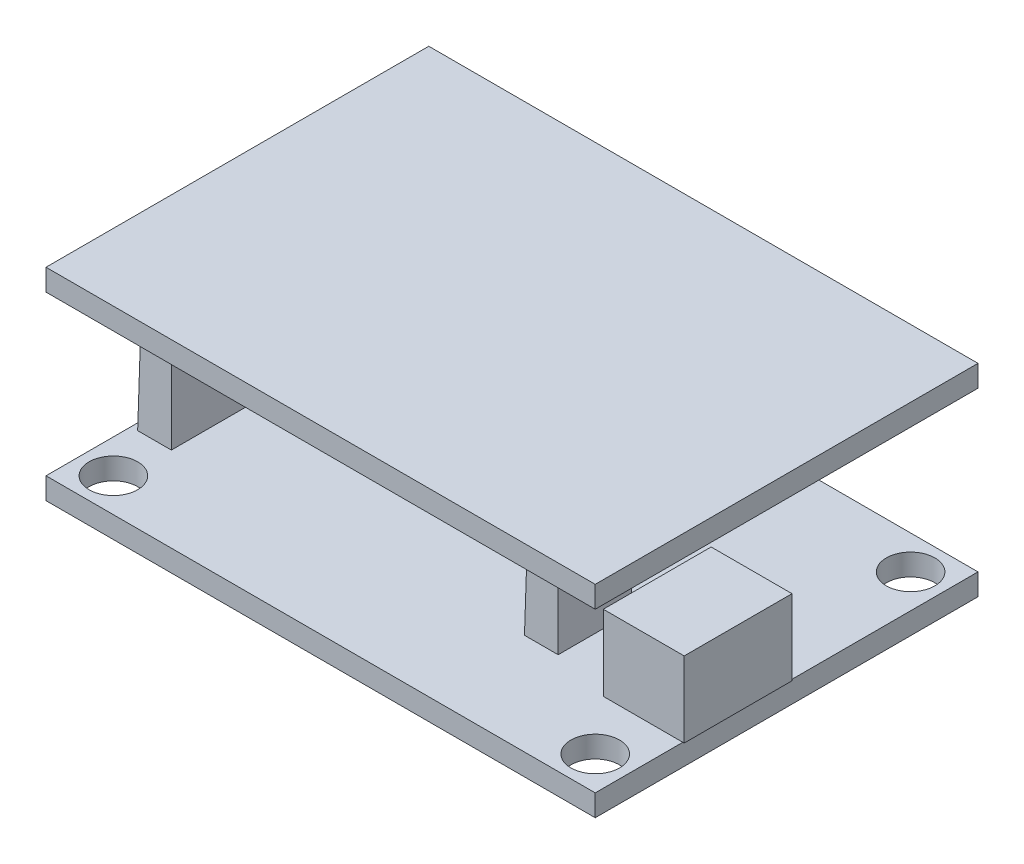
ISO-10303-21;
HEADER;
FILE_DESCRIPTION(('STEP AP214'),'2;1');
FILE_NAME('part.step','',(''),(''),'','','');
FILE_SCHEMA(('AUTOMOTIVE_DESIGN { 1 0 10303 214 1 1 1 1 }'));
ENDSEC;
DATA;
#1=APPLICATION_CONTEXT('core data for automotive mechanical design processes');
#2=APPLICATION_PROTOCOL_DEFINITION('international standard','automotive_design',2000,#1);
#3=PRODUCT_CONTEXT('',#1,'mechanical');
#4=PRODUCT('Part','Part','',(#3));
#5=PRODUCT_RELATED_PRODUCT_CATEGORY('part','',(#4));
#6=PRODUCT_DEFINITION_FORMATION('','',#4);
#7=PRODUCT_DEFINITION_CONTEXT('part definition',#1,'design');
#8=PRODUCT_DEFINITION('design','',#6,#7);
#9=PRODUCT_DEFINITION_SHAPE('','',#8);
#10=(LENGTH_UNIT() NAMED_UNIT(*) SI_UNIT(.MILLI.,.METRE.));
#11=(NAMED_UNIT(*) PLANE_ANGLE_UNIT() SI_UNIT($,.RADIAN.));
#12=(NAMED_UNIT(*) SI_UNIT($,.STERADIAN.) SOLID_ANGLE_UNIT());
#13=UNCERTAINTY_MEASURE_WITH_UNIT(LENGTH_MEASURE(1.E-05),#10,'distance_accuracy_value','');
#14=(GEOMETRIC_REPRESENTATION_CONTEXT(3) GLOBAL_UNCERTAINTY_ASSIGNED_CONTEXT((#13)) GLOBAL_UNIT_ASSIGNED_CONTEXT((#10,
#11,#12)) REPRESENTATION_CONTEXT('',''));
#15=CARTESIAN_POINT('',(0.,0.,0.));
#16=DIRECTION('',(0.,0.,1.));
#17=DIRECTION('',(1.,0.,0.));
#18=AXIS2_PLACEMENT_3D('',#15,#16,#17);
#19=CARTESIAN_POINT('',(40.75,13.4,0.));
#20=DIRECTION('',(-1.,0.,0.));
#21=DIRECTION('',(0.,0.,1.));
#22=AXIS2_PLACEMENT_3D('',#19,#20,#21);
#23=PLANE('',#22);
#24=DIRECTION('',(0.,0.,1.));
#25=VECTOR('',#24,1.);
#26=CARTESIAN_POINT('',(40.75,15.,0.));
#27=LINE('',#26,#25);
#28=CARTESIAN_POINT('',(40.75,15.,-28.4));
#29=VERTEX_POINT('',#28);
#30=CARTESIAN_POINT('',(40.75,15.,0.));
#31=VERTEX_POINT('',#30);
#32=EDGE_CURVE('E105',#29,#31,#27,.T.);
#33=ORIENTED_EDGE('',*,*,#32,.T.);
#34=DIRECTION('',(0.,1.,0.));
#35=VECTOR('',#34,1.);
#36=CARTESIAN_POINT('',(40.75,13.4,0.));
#37=LINE('',#36,#35);
#38=CARTESIAN_POINT('',(40.75,13.4,0.));
#39=VERTEX_POINT('',#38);
#40=EDGE_CURVE('E12',#39,#31,#37,.T.);
#41=ORIENTED_EDGE('',*,*,#40,.F.);
#42=DIRECTION('',(0.,0.,1.));
#43=VECTOR('',#42,1.);
#44=CARTESIAN_POINT('',(40.75,13.4,0.));
#45=LINE('',#44,#43);
#46=CARTESIAN_POINT('',(40.75,13.4,-28.4));
#47=VERTEX_POINT('',#46);
#48=EDGE_CURVE('E93',#47,#39,#45,.T.);
#49=ORIENTED_EDGE('',*,*,#48,.F.);
#50=DIRECTION('',(0.,1.,0.));
#51=VECTOR('',#50,1.);
#52=CARTESIAN_POINT('',(40.75,13.4,-28.4));
#53=LINE('',#52,#51);
#54=EDGE_CURVE('E101',#47,#29,#53,.T.);
#55=ORIENTED_EDGE('',*,*,#54,.T.);
#56=EDGE_LOOP('',(#33,#41,#49,#55));
#57=FACE_BOUND('',#56,.T.);
#58=ADVANCED_FACE('F42',(#57),#23,.F.);
#59=CARTESIAN_POINT('',(40.75,13.4,0.));
#60=DIRECTION('',(0.,0.,-1.));
#61=DIRECTION('',(-1.,0.,0.));
#62=AXIS2_PLACEMENT_3D('',#59,#60,#61);
#63=PLANE('',#62);
#64=DIRECTION('',(-1.,0.,0.));
#65=VECTOR('',#64,1.);
#66=CARTESIAN_POINT('',(40.75,15.,0.));
#67=LINE('',#66,#65);
#68=CARTESIAN_POINT('',(0.,15.,0.));
#69=VERTEX_POINT('',#68);
#70=EDGE_CURVE('E97',#31,#69,#67,.T.);
#71=ORIENTED_EDGE('',*,*,#70,.T.);
#72=DIRECTION('',(0.,1.,0.));
#73=VECTOR('',#72,1.);
#74=CARTESIAN_POINT('',(0.,13.4,0.));
#75=LINE('',#74,#73);
#76=CARTESIAN_POINT('',(0.,13.4,0.));
#77=VERTEX_POINT('',#76);
#78=EDGE_CURVE('E50',#77,#69,#75,.T.);
#79=ORIENTED_EDGE('',*,*,#78,.F.);
#80=DIRECTION('',(-1.,0.,0.));
#81=VECTOR('',#80,1.);
#82=CARTESIAN_POINT('',(40.75,13.4,0.));
#83=LINE('',#82,#81);
#84=EDGE_CURVE('E88',#39,#77,#83,.T.);
#85=ORIENTED_EDGE('',*,*,#84,.F.);
#86=ORIENTED_EDGE('',*,*,#40,.T.);
#87=EDGE_LOOP('',(#71,#79,#85,#86));
#88=FACE_BOUND('',#87,.T.);
#89=ADVANCED_FACE('F96',(#88),#63,.F.);
#90=CARTESIAN_POINT('',(0.,13.4,0.));
#91=DIRECTION('',(1.,0.,0.));
#92=DIRECTION('',(0.,0.,-1.));
#93=AXIS2_PLACEMENT_3D('',#90,#91,#92);
#94=PLANE('',#93);
#95=DIRECTION('',(0.,0.,-1.));
#96=VECTOR('',#95,1.);
#97=CARTESIAN_POINT('',(0.,15.,0.));
#98=LINE('',#97,#96);
#99=CARTESIAN_POINT('',(0.,15.,-28.4));
#100=VERTEX_POINT('',#99);
#101=EDGE_CURVE('E75',#69,#100,#98,.T.);
#102=ORIENTED_EDGE('',*,*,#101,.T.);
#103=DIRECTION('',(0.,1.,0.));
#104=VECTOR('',#103,1.);
#105=CARTESIAN_POINT('',(0.,13.4,-28.4));
#106=LINE('',#105,#104);
#107=CARTESIAN_POINT('',(0.,13.4,-28.4));
#108=VERTEX_POINT('',#107);
#109=EDGE_CURVE('E98',#108,#100,#106,.T.);
#110=ORIENTED_EDGE('',*,*,#109,.F.);
#111=DIRECTION('',(0.,0.,-1.));
#112=VECTOR('',#111,1.);
#113=CARTESIAN_POINT('',(0.,13.4,0.));
#114=LINE('',#113,#112);
#115=EDGE_CURVE('E91',#77,#108,#114,.T.);
#116=ORIENTED_EDGE('',*,*,#115,.F.);
#117=ORIENTED_EDGE('',*,*,#78,.T.);
#118=EDGE_LOOP('',(#102,#110,#116,#117));
#119=FACE_BOUND('',#118,.T.);
#120=ADVANCED_FACE('F99',(#119),#94,.F.);
#121=CARTESIAN_POINT('',(40.75,13.4,-28.4));
#122=DIRECTION('',(0.,0.,1.));
#123=DIRECTION('',(1.,0.,0.));
#124=AXIS2_PLACEMENT_3D('',#121,#122,#123);
#125=PLANE('',#124);
#126=DIRECTION('',(1.,0.,0.));
#127=VECTOR('',#126,1.);
#128=CARTESIAN_POINT('',(40.75,15.,-28.4));
#129=LINE('',#128,#127);
#130=EDGE_CURVE('E81',#100,#29,#129,.T.);
#131=ORIENTED_EDGE('',*,*,#130,.T.);
#132=ORIENTED_EDGE('',*,*,#54,.F.);
#133=DIRECTION('',(1.,0.,0.));
#134=VECTOR('',#133,1.);
#135=CARTESIAN_POINT('',(40.75,13.4,-28.4));
#136=LINE('',#135,#134);
#137=EDGE_CURVE('E58',#108,#47,#136,.T.);
#138=ORIENTED_EDGE('',*,*,#137,.F.);
#139=ORIENTED_EDGE('',*,*,#109,.T.);
#140=EDGE_LOOP('',(#131,#132,#138,#139));
#141=FACE_BOUND('',#140,.T.);
#142=ADVANCED_FACE('F112',(#141),#125,.F.);
#143=CARTESIAN_POINT('',(40.75,13.4,-28.4));
#144=DIRECTION('',(0.,1.,0.));
#145=DIRECTION('',(0.,0.,1.));
#146=AXIS2_PLACEMENT_3D('',#143,#144,#145);
#147=PLANE('',#146);
#148=ORIENTED_EDGE('',*,*,#48,.T.);
#149=ORIENTED_EDGE('',*,*,#84,.T.);
#150=ORIENTED_EDGE('',*,*,#115,.T.);
#151=ORIENTED_EDGE('',*,*,#137,.T.);
#152=EDGE_LOOP('',(#148,#149,#150,#151));
#153=FACE_BOUND('',#152,.T.);
#154=ADVANCED_FACE('F89',(#153),#147,.F.);
#155=CARTESIAN_POINT('',(40.75,15.,-28.4));
#156=DIRECTION('',(0.,1.,0.));
#157=DIRECTION('',(0.,0.,1.));
#158=AXIS2_PLACEMENT_3D('',#155,#156,#157);
#159=PLANE('',#158);
#160=ORIENTED_EDGE('',*,*,#32,.F.);
#161=ORIENTED_EDGE('',*,*,#130,.F.);
#162=ORIENTED_EDGE('',*,*,#101,.F.);
#163=ORIENTED_EDGE('',*,*,#70,.F.);
#164=EDGE_LOOP('',(#160,#161,#162,#163));
#165=FACE_BOUND('',#164,.T.);
#166=ADVANCED_FACE('F115',(#165),#159,.T.);
#167=CLOSED_SHELL('',(#58,#89,#120,#142,#154,#166));
#168=MANIFOLD_SOLID_BREP('B2',#167);
#169=CARTESIAN_POINT('',(0.,1.6,-28.4));
#170=DIRECTION('',(0.,-1.,0.));
#171=DIRECTION('',(0.,0.,-1.));
#172=AXIS2_PLACEMENT_3D('',#169,#170,#171);
#173=PLANE('',#172);
#174=DIRECTION('',(-1.,0.,0.));
#175=VECTOR('',#174,1.);
#176=CARTESIAN_POINT('',(28.,1.6,-7.5));
#177=LINE('',#176,#175);
#178=CARTESIAN_POINT('',(30.5,1.6,-7.5));
#179=VERTEX_POINT('',#178);
#180=CARTESIAN_POINT('',(28.,1.6,-7.5));
#181=VERTEX_POINT('',#180);
#182=EDGE_CURVE('E307',#179,#181,#177,.T.);
#183=ORIENTED_EDGE('',*,*,#182,.T.);
#184=DIRECTION('',(0.,0.,-1.));
#185=VECTOR('',#184,1.);
#186=CARTESIAN_POINT('',(28.,1.6,-7.5));
#187=LINE('',#186,#185);
#188=CARTESIAN_POINT('',(28.,1.6,-13.));
#189=VERTEX_POINT('',#188);
#190=EDGE_CURVE('E290',#181,#189,#187,.T.);
#191=ORIENTED_EDGE('',*,*,#190,.T.);
#192=DIRECTION('',(1.,0.,0.));
#193=VECTOR('',#192,1.);
#194=CARTESIAN_POINT('',(28.,1.6,-13.));
#195=LINE('',#194,#193);
#196=CARTESIAN_POINT('',(30.5,1.6,-13.));
#197=VERTEX_POINT('',#196);
#198=EDGE_CURVE('E301',#189,#197,#195,.T.);
#199=ORIENTED_EDGE('',*,*,#198,.T.);
#200=DIRECTION('',(0.,0.,1.));
#201=VECTOR('',#200,1.);
#202=CARTESIAN_POINT('',(30.5,1.6,-7.5));
#203=LINE('',#202,#201);
#204=EDGE_CURVE('E182',#197,#179,#203,.T.);
#205=ORIENTED_EDGE('',*,*,#204,.T.);
#206=EDGE_LOOP('',(#183,#191,#199,#205));
#207=FACE_BOUND('',#206,.T.);
#208=DIRECTION('',(-1.,0.,0.));
#209=VECTOR('',#208,1.);
#210=CARTESIAN_POINT('',(0.5,1.6,-6.3));
#211=LINE('',#210,#209);
#212=CARTESIAN_POINT('',(3.,1.6,-6.3));
#213=VERTEX_POINT('',#212);
#214=CARTESIAN_POINT('',(0.5,1.6,-6.3));
#215=VERTEX_POINT('',#214);
#216=EDGE_CURVE('E332',#213,#215,#211,.T.);
#217=ORIENTED_EDGE('',*,*,#216,.T.);
#218=DIRECTION('',(0.,0.,-1.));
#219=VECTOR('',#218,1.);
#220=CARTESIAN_POINT('',(0.5,1.6,-6.3));
#221=LINE('',#220,#219);
#222=CARTESIAN_POINT('',(0.500000000000002,1.6,-21.5));
#223=VERTEX_POINT('',#222);
#224=EDGE_CURVE('E313',#215,#223,#221,.T.);
#225=ORIENTED_EDGE('',*,*,#224,.T.);
#226=DIRECTION('',(1.,0.,0.));
#227=VECTOR('',#226,1.);
#228=CARTESIAN_POINT('',(0.500000000000002,1.6,-21.5));
#229=LINE('',#228,#227);
#230=CARTESIAN_POINT('',(3.,1.6,-21.5));
#231=VERTEX_POINT('',#230);
#232=EDGE_CURVE('E328',#223,#231,#229,.T.);
#233=ORIENTED_EDGE('',*,*,#232,.T.);
#234=DIRECTION('',(0.,0.,1.));
#235=VECTOR('',#234,1.);
#236=CARTESIAN_POINT('',(3.,1.6,-6.3));
#237=LINE('',#236,#235);
#238=EDGE_CURVE('E190',#231,#213,#237,.T.);
#239=ORIENTED_EDGE('',*,*,#238,.T.);
#240=EDGE_LOOP('',(#217,#225,#233,#239));
#241=FACE_BOUND('',#240,.T.);
#242=CARTESIAN_POINT('',(2.5,1.6,-25.9));
#243=DIRECTION('',(0.,1.,0.));
#244=DIRECTION('',(0.,0.,1.));
#245=AXIS2_PLACEMENT_3D('',#242,#243,#244);
#246=CIRCLE('',#245,1.8);
#247=CARTESIAN_POINT('',(2.5,1.6,-24.1));
#248=VERTEX_POINT('',#247);
#249=EDGE_CURVE('E402',#248,#248,#246,.T.);
#250=ORIENTED_EDGE('',*,*,#249,.F.);
#251=EDGE_LOOP('',(#250));
#252=FACE_BOUND('',#251,.T.);
#253=CARTESIAN_POINT('',(38.25,1.6,-25.9));
#254=DIRECTION('',(0.,1.,0.));
#255=DIRECTION('',(0.,0.,1.));
#256=AXIS2_PLACEMENT_3D('',#253,#254,#255);
#257=CIRCLE('',#256,1.8);
#258=CARTESIAN_POINT('',(38.25,1.6,-24.1));
#259=VERTEX_POINT('',#258);
#260=EDGE_CURVE('E396',#259,#259,#257,.T.);
#261=ORIENTED_EDGE('',*,*,#260,.F.);
#262=EDGE_LOOP('',(#261));
#263=FACE_BOUND('',#262,.T.);
#264=CARTESIAN_POINT('',(38.25,1.6,-2.5));
#265=DIRECTION('',(0.,1.,0.));
#266=DIRECTION('',(0.,0.,1.));
#267=AXIS2_PLACEMENT_3D('',#264,#265,#266);
#268=CIRCLE('',#267,1.8);
#269=CARTESIAN_POINT('',(38.25,1.6,-0.699999999999999));
#270=VERTEX_POINT('',#269);
#271=EDGE_CURVE('E390',#270,#270,#268,.T.);
#272=ORIENTED_EDGE('',*,*,#271,.F.);
#273=EDGE_LOOP('',(#272));
#274=FACE_BOUND('',#273,.T.);
#275=CARTESIAN_POINT('',(2.5,1.6,-2.5));
#276=DIRECTION('',(0.,1.,0.));
#277=DIRECTION('',(0.,0.,1.));
#278=AXIS2_PLACEMENT_3D('',#275,#276,#277);
#279=CIRCLE('',#278,1.8);
#280=CARTESIAN_POINT('',(2.5,1.6,-0.699999999999999));
#281=VERTEX_POINT('',#280);
#282=EDGE_CURVE('E386',#281,#281,#279,.T.);
#283=ORIENTED_EDGE('',*,*,#282,.F.);
#284=EDGE_LOOP('',(#283));
#285=FACE_BOUND('',#284,.T.);
#286=DIRECTION('',(-1.,0.,0.));
#287=VECTOR('',#286,1.);
#288=CARTESIAN_POINT('',(34.85,1.6,-14.5));
#289=LINE('',#288,#287);
#290=CARTESIAN_POINT('',(40.75,1.6,-14.5));
#291=VERTEX_POINT('',#290);
#292=CARTESIAN_POINT('',(34.85,1.6,-14.5));
#293=VERTEX_POINT('',#292);
#294=EDGE_CURVE('E40',#291,#293,#289,.T.);
#295=ORIENTED_EDGE('',*,*,#294,.F.);
#296=DIRECTION('',(0.,0.,-1.));
#297=VECTOR('',#296,1.);
#298=CARTESIAN_POINT('',(40.75,1.6,0.));
#299=LINE('',#298,#297);
#300=CARTESIAN_POINT('',(40.75,1.6,-28.4));
#301=VERTEX_POINT('',#300);
#302=EDGE_CURVE('E417',#291,#301,#299,.T.);
#303=ORIENTED_EDGE('',*,*,#302,.T.);
#304=DIRECTION('',(-1.,0.,0.));
#305=VECTOR('',#304,1.);
#306=CARTESIAN_POINT('',(0.,1.6,-28.4));
#307=LINE('',#306,#305);
#308=CARTESIAN_POINT('',(0.,1.6,-28.4));
#309=VERTEX_POINT('',#308);
#310=EDGE_CURVE('E420',#301,#309,#307,.T.);
#311=ORIENTED_EDGE('',*,*,#310,.T.);
#312=DIRECTION('',(0.,0.,1.));
#313=VECTOR('',#312,1.);
#314=CARTESIAN_POINT('',(0.,1.6,0.));
#315=LINE('',#314,#313);
#316=CARTESIAN_POINT('',(0.,1.6,0.));
#317=VERTEX_POINT('',#316);
#318=EDGE_CURVE('E411',#309,#317,#315,.T.);
#319=ORIENTED_EDGE('',*,*,#318,.T.);
#320=DIRECTION('',(1.,0.,0.));
#321=VECTOR('',#320,1.);
#322=CARTESIAN_POINT('',(0.,1.6,0.));
#323=LINE('',#322,#321);
#324=CARTESIAN_POINT('',(40.75,1.6,0.));
#325=VERTEX_POINT('',#324);
#326=EDGE_CURVE('E414',#317,#325,#323,.T.);
#327=ORIENTED_EDGE('',*,*,#326,.T.);
#328=CARTESIAN_POINT('',(40.75,1.6,-6.5));
#329=VERTEX_POINT('',#328);
#330=EDGE_CURVE('E418',#325,#329,#299,.T.);
#331=ORIENTED_EDGE('',*,*,#330,.T.);
#332=DIRECTION('',(1.,0.,0.));
#333=VECTOR('',#332,1.);
#334=CARTESIAN_POINT('',(34.85,1.6,-6.5));
#335=LINE('',#334,#333);
#336=CARTESIAN_POINT('',(34.85,1.6,-6.5));
#337=VERTEX_POINT('',#336);
#338=EDGE_CURVE('E369',#337,#329,#335,.T.);
#339=ORIENTED_EDGE('',*,*,#338,.F.);
#340=DIRECTION('',(0.,0.,1.));
#341=VECTOR('',#340,1.);
#342=CARTESIAN_POINT('',(34.85,1.6,-14.5));
#343=LINE('',#342,#341);
#344=EDGE_CURVE('E338',#293,#337,#343,.T.);
#345=ORIENTED_EDGE('',*,*,#344,.F.);
#346=EDGE_LOOP('',(#295,#303,#311,#319,#327,#331,#339,#345));
#347=FACE_BOUND('',#346,.T.);
#348=ADVANCED_FACE('F165',(#207,#241,#252,#263,#274,#285,#347),#173,.F.);
#349=CARTESIAN_POINT('',(0.,1.6,0.));
#350=DIRECTION('',(1.,0.,0.));
#351=DIRECTION('',(0.,0.,-1.));
#352=AXIS2_PLACEMENT_3D('',#349,#350,#351);
#353=PLANE('',#352);
#354=DIRECTION('',(0.,0.,1.));
#355=VECTOR('',#354,1.);
#356=CARTESIAN_POINT('',(0.,0.,0.));
#357=LINE('',#356,#355);
#358=CARTESIAN_POINT('',(0.,0.,-28.4));
#359=VERTEX_POINT('',#358);
#360=CARTESIAN_POINT('',(0.,0.,0.));
#361=VERTEX_POINT('',#360);
#362=EDGE_CURVE('E408',#359,#361,#357,.T.);
#363=ORIENTED_EDGE('',*,*,#362,.T.);
#364=DIRECTION('',(0.,-1.,0.));
#365=VECTOR('',#364,1.);
#366=CARTESIAN_POINT('',(0.,1.6,0.));
#367=LINE('',#366,#365);
#368=EDGE_CURVE('E169',#317,#361,#367,.T.);
#369=ORIENTED_EDGE('',*,*,#368,.F.);
#370=ORIENTED_EDGE('',*,*,#318,.F.);
#371=DIRECTION('',(0.,-1.,0.));
#372=VECTOR('',#371,1.);
#373=CARTESIAN_POINT('',(0.,1.6,-28.4));
#374=LINE('',#373,#372);
#375=EDGE_CURVE('E423',#309,#359,#374,.T.);
#376=ORIENTED_EDGE('',*,*,#375,.T.);
#377=EDGE_LOOP('',(#363,#369,#370,#376));
#378=FACE_BOUND('',#377,.T.);
#379=ADVANCED_FACE('F167',(#378),#353,.F.);
#380=CARTESIAN_POINT('',(0.,1.6,0.));
#381=DIRECTION('',(0.,0.,-1.));
#382=DIRECTION('',(-1.,0.,0.));
#383=AXIS2_PLACEMENT_3D('',#380,#381,#382);
#384=PLANE('',#383);
#385=DIRECTION('',(1.,0.,0.));
#386=VECTOR('',#385,1.);
#387=CARTESIAN_POINT('',(0.,0.,0.));
#388=LINE('',#387,#386);
#389=CARTESIAN_POINT('',(40.75,0.,0.));
#390=VERTEX_POINT('',#389);
#391=EDGE_CURVE('E426',#361,#390,#388,.T.);
#392=ORIENTED_EDGE('',*,*,#391,.T.);
#393=DIRECTION('',(0.,-1.,0.));
#394=VECTOR('',#393,1.);
#395=CARTESIAN_POINT('',(40.75,1.6,0.));
#396=LINE('',#395,#394);
#397=EDGE_CURVE('E435',#325,#390,#396,.T.);
#398=ORIENTED_EDGE('',*,*,#397,.F.);
#399=ORIENTED_EDGE('',*,*,#326,.F.);
#400=ORIENTED_EDGE('',*,*,#368,.T.);
#401=EDGE_LOOP('',(#392,#398,#399,#400));
#402=FACE_BOUND('',#401,.T.);
#403=ADVANCED_FACE('F444',(#402),#384,.F.);
#404=CARTESIAN_POINT('',(40.75,1.6,0.));
#405=DIRECTION('',(-1.,0.,0.));
#406=DIRECTION('',(0.,0.,1.));
#407=AXIS2_PLACEMENT_3D('',#404,#405,#406);
#408=PLANE('',#407);
#409=DIRECTION('',(0.,0.,-1.));
#410=VECTOR('',#409,1.);
#411=CARTESIAN_POINT('',(40.75,0.,0.));
#412=LINE('',#411,#410);
#413=CARTESIAN_POINT('',(40.75,0.,-28.4));
#414=VERTEX_POINT('',#413);
#415=EDGE_CURVE('E428',#390,#414,#412,.T.);
#416=ORIENTED_EDGE('',*,*,#415,.T.);
#417=DIRECTION('',(0.,-1.,0.));
#418=VECTOR('',#417,1.);
#419=CARTESIAN_POINT('',(40.75,1.6,-28.4));
#420=LINE('',#419,#418);
#421=EDGE_CURVE('E433',#301,#414,#420,.T.);
#422=ORIENTED_EDGE('',*,*,#421,.F.);
#423=ORIENTED_EDGE('',*,*,#302,.F.);
#424=EDGE_CURVE('E421',#329,#291,#299,.T.);
#425=ORIENTED_EDGE('',*,*,#424,.F.);
#426=ORIENTED_EDGE('',*,*,#330,.F.);
#427=ORIENTED_EDGE('',*,*,#397,.T.);
#428=EDGE_LOOP('',(#416,#422,#423,#425,#426,#427));
#429=FACE_BOUND('',#428,.T.);
#430=ADVANCED_FACE('F453',(#429),#408,.F.);
#431=CARTESIAN_POINT('',(0.,1.6,-28.4));
#432=DIRECTION('',(0.,0.,1.));
#433=DIRECTION('',(1.,0.,0.));
#434=AXIS2_PLACEMENT_3D('',#431,#432,#433);
#435=PLANE('',#434);
#436=DIRECTION('',(-1.,0.,0.));
#437=VECTOR('',#436,1.);
#438=CARTESIAN_POINT('',(0.,0.,-28.4));
#439=LINE('',#438,#437);
#440=EDGE_CURVE('E415',#414,#359,#439,.T.);
#441=ORIENTED_EDGE('',*,*,#440,.T.);
#442=ORIENTED_EDGE('',*,*,#375,.F.);
#443=ORIENTED_EDGE('',*,*,#310,.F.);
#444=ORIENTED_EDGE('',*,*,#421,.T.);
#445=EDGE_LOOP('',(#441,#442,#443,#444));
#446=FACE_BOUND('',#445,.T.);
#447=ADVANCED_FACE('F457',(#446),#435,.F.);
#448=CARTESIAN_POINT('',(0.,0.,-28.4));
#449=DIRECTION('',(0.,-1.,0.));
#450=DIRECTION('',(0.,0.,-1.));
#451=AXIS2_PLACEMENT_3D('',#448,#449,#450);
#452=PLANE('',#451);
#453=CARTESIAN_POINT('',(2.5,0.,-2.5));
#454=DIRECTION('',(0.,1.,0.));
#455=DIRECTION('',(0.,0.,1.));
#456=AXIS2_PLACEMENT_3D('',#453,#454,#455);
#457=CIRCLE('',#456,1.8);
#458=CARTESIAN_POINT('',(2.5,0.,-0.699999999999999));
#459=VERTEX_POINT('',#458);
#460=EDGE_CURVE('E387',#459,#459,#457,.T.);
#461=ORIENTED_EDGE('',*,*,#460,.T.);
#462=EDGE_LOOP('',(#461));
#463=FACE_BOUND('',#462,.T.);
#464=CARTESIAN_POINT('',(38.25,0.,-2.5));
#465=DIRECTION('',(0.,1.,0.));
#466=DIRECTION('',(0.,0.,1.));
#467=AXIS2_PLACEMENT_3D('',#464,#465,#466);
#468=CIRCLE('',#467,1.8);
#469=CARTESIAN_POINT('',(38.25,0.,-0.699999999999999));
#470=VERTEX_POINT('',#469);
#471=EDGE_CURVE('E393',#470,#470,#468,.T.);
#472=ORIENTED_EDGE('',*,*,#471,.T.);
#473=EDGE_LOOP('',(#472));
#474=FACE_BOUND('',#473,.T.);
#475=CARTESIAN_POINT('',(38.25,0.,-25.9));
#476=DIRECTION('',(0.,1.,0.));
#477=DIRECTION('',(0.,0.,1.));
#478=AXIS2_PLACEMENT_3D('',#475,#476,#477);
#479=CIRCLE('',#478,1.8);
#480=CARTESIAN_POINT('',(38.25,0.,-24.1));
#481=VERTEX_POINT('',#480);
#482=EDGE_CURVE('E399',#481,#481,#479,.T.);
#483=ORIENTED_EDGE('',*,*,#482,.T.);
#484=EDGE_LOOP('',(#483));
#485=FACE_BOUND('',#484,.T.);
#486=CARTESIAN_POINT('',(2.5,0.,-25.9));
#487=DIRECTION('',(0.,1.,0.));
#488=DIRECTION('',(0.,0.,1.));
#489=AXIS2_PLACEMENT_3D('',#486,#487,#488);
#490=CIRCLE('',#489,1.8);
#491=CARTESIAN_POINT('',(2.5,0.,-24.1));
#492=VERTEX_POINT('',#491);
#493=EDGE_CURVE('E405',#492,#492,#490,.T.);
#494=ORIENTED_EDGE('',*,*,#493,.T.);
#495=EDGE_LOOP('',(#494));
#496=FACE_BOUND('',#495,.T.);
#497=ORIENTED_EDGE('',*,*,#362,.F.);
#498=ORIENTED_EDGE('',*,*,#440,.F.);
#499=ORIENTED_EDGE('',*,*,#415,.F.);
#500=ORIENTED_EDGE('',*,*,#391,.F.);
#501=EDGE_LOOP('',(#497,#498,#499,#500));
#502=FACE_BOUND('',#501,.T.);
#503=ADVANCED_FACE('F451',(#463,#474,#485,#496,#502),#452,.T.);
#504=CARTESIAN_POINT('',(2.5,0.,-25.9));
#505=DIRECTION('',(0.,1.,0.));
#506=DIRECTION('',(0.,0.,1.));
#507=AXIS2_PLACEMENT_3D('',#504,#505,#506);
#508=CYLINDRICAL_SURFACE('',#507,1.8);
#509=ORIENTED_EDGE('',*,*,#493,.F.);
#510=EDGE_LOOP('',(#509));
#511=FACE_BOUND('',#510,.T.);
#512=ORIENTED_EDGE('',*,*,#249,.T.);
#513=EDGE_LOOP('',(#512));
#514=FACE_BOUND('',#513,.T.);
#515=ADVANCED_FACE('F503',(#511,#514),#508,.F.);
#516=CARTESIAN_POINT('',(38.25,0.,-25.9));
#517=DIRECTION('',(0.,1.,0.));
#518=DIRECTION('',(0.,0.,1.));
#519=AXIS2_PLACEMENT_3D('',#516,#517,#518);
#520=CYLINDRICAL_SURFACE('',#519,1.8);
#521=ORIENTED_EDGE('',*,*,#482,.F.);
#522=EDGE_LOOP('',(#521));
#523=FACE_BOUND('',#522,.T.);
#524=ORIENTED_EDGE('',*,*,#260,.T.);
#525=EDGE_LOOP('',(#524));
#526=FACE_BOUND('',#525,.T.);
#527=ADVANCED_FACE('F536',(#523,#526),#520,.F.);
#528=CARTESIAN_POINT('',(38.25,0.,-2.5));
#529=DIRECTION('',(0.,1.,0.));
#530=DIRECTION('',(0.,0.,1.));
#531=AXIS2_PLACEMENT_3D('',#528,#529,#530);
#532=CYLINDRICAL_SURFACE('',#531,1.8);
#533=ORIENTED_EDGE('',*,*,#471,.F.);
#534=EDGE_LOOP('',(#533));
#535=FACE_BOUND('',#534,.T.);
#536=ORIENTED_EDGE('',*,*,#271,.T.);
#537=EDGE_LOOP('',(#536));
#538=FACE_BOUND('',#537,.T.);
#539=ADVANCED_FACE('F543',(#535,#538),#532,.F.);
#540=CARTESIAN_POINT('',(2.5,0.,-2.5));
#541=DIRECTION('',(0.,1.,0.));
#542=DIRECTION('',(0.,0.,1.));
#543=AXIS2_PLACEMENT_3D('',#540,#541,#542);
#544=CYLINDRICAL_SURFACE('',#543,1.8);
#545=ORIENTED_EDGE('',*,*,#460,.F.);
#546=EDGE_LOOP('',(#545));
#547=FACE_BOUND('',#546,.T.);
#548=ORIENTED_EDGE('',*,*,#282,.T.);
#549=EDGE_LOOP('',(#548));
#550=FACE_BOUND('',#549,.T.);
#551=ADVANCED_FACE('F550',(#547,#550),#544,.F.);
#552=CARTESIAN_POINT('',(34.85,1.6,-6.5));
#553=DIRECTION('',(0.,1.,0.));
#554=DIRECTION('',(0.,0.,1.));
#555=AXIS2_PLACEMENT_3D('',#552,#553,#554);
#556=PLANE('',#555);
#557=CARTESIAN_POINT('',(40.85,1.6,-6.5));
#558=VERTEX_POINT('',#557);
#559=EDGE_CURVE('E368',#329,#558,#335,.T.);
#560=ORIENTED_EDGE('',*,*,#559,.F.);
#561=ORIENTED_EDGE('',*,*,#424,.T.);
#562=CARTESIAN_POINT('',(40.85,1.6,-14.5));
#563=VERTEX_POINT('',#562);
#564=EDGE_CURVE('E175',#563,#291,#289,.T.);
#565=ORIENTED_EDGE('',*,*,#564,.F.);
#566=DIRECTION('',(0.,0.,-1.));
#567=VECTOR('',#566,1.);
#568=CARTESIAN_POINT('',(40.85,1.6,-14.5));
#569=LINE('',#568,#567);
#570=EDGE_CURVE('E372',#558,#563,#569,.T.);
#571=ORIENTED_EDGE('',*,*,#570,.F.);
#572=EDGE_LOOP('',(#560,#561,#565,#571));
#573=FACE_BOUND('',#572,.T.);
#574=ADVANCED_FACE('F464',(#573),#556,.F.);
#575=CARTESIAN_POINT('',(34.85,7.2,-14.5));
#576=DIRECTION('',(1.,0.,0.));
#577=DIRECTION('',(0.,0.,-1.));
#578=AXIS2_PLACEMENT_3D('',#575,#576,#577);
#579=PLANE('',#578);
#580=ORIENTED_EDGE('',*,*,#344,.T.);
#581=DIRECTION('',(0.,-1.,0.));
#582=VECTOR('',#581,1.);
#583=CARTESIAN_POINT('',(34.85,7.2,-6.5));
#584=LINE('',#583,#582);
#585=CARTESIAN_POINT('',(34.85,7.2,-6.5));
#586=VERTEX_POINT('',#585);
#587=EDGE_CURVE('E383',#586,#337,#584,.T.);
#588=ORIENTED_EDGE('',*,*,#587,.F.);
#589=DIRECTION('',(0.,0.,1.));
#590=VECTOR('',#589,1.);
#591=CARTESIAN_POINT('',(34.85,7.2,-14.5));
#592=LINE('',#591,#590);
#593=CARTESIAN_POINT('',(34.85,7.2,-14.5));
#594=VERTEX_POINT('',#593);
#595=EDGE_CURVE('E356',#594,#586,#592,.T.);
#596=ORIENTED_EDGE('',*,*,#595,.F.);
#597=DIRECTION('',(0.,-1.,0.));
#598=VECTOR('',#597,1.);
#599=CARTESIAN_POINT('',(34.85,7.2,-14.5));
#600=LINE('',#599,#598);
#601=EDGE_CURVE('E365',#594,#293,#600,.T.);
#602=ORIENTED_EDGE('',*,*,#601,.T.);
#603=EDGE_LOOP('',(#580,#588,#596,#602));
#604=FACE_BOUND('',#603,.T.);
#605=ADVANCED_FACE('F479',(#604),#579,.F.);
#606=CARTESIAN_POINT('',(34.85,7.2,-6.5));
#607=DIRECTION('',(0.,0.,-1.));
#608=DIRECTION('',(-1.,0.,0.));
#609=AXIS2_PLACEMENT_3D('',#606,#607,#608);
#610=PLANE('',#609);
#611=ORIENTED_EDGE('',*,*,#338,.T.);
#612=ORIENTED_EDGE('',*,*,#559,.T.);
#613=DIRECTION('',(0.,-1.,0.));
#614=VECTOR('',#613,1.);
#615=CARTESIAN_POINT('',(40.85,7.2,-6.5));
#616=LINE('',#615,#614);
#617=CARTESIAN_POINT('',(40.85,7.2,-6.5));
#618=VERTEX_POINT('',#617);
#619=EDGE_CURVE('E380',#618,#558,#616,.T.);
#620=ORIENTED_EDGE('',*,*,#619,.F.);
#621=DIRECTION('',(1.,0.,0.));
#622=VECTOR('',#621,1.);
#623=CARTESIAN_POINT('',(34.85,7.2,-6.5));
#624=LINE('',#623,#622);
#625=EDGE_CURVE('E359',#586,#618,#624,.T.);
#626=ORIENTED_EDGE('',*,*,#625,.F.);
#627=ORIENTED_EDGE('',*,*,#587,.T.);
#628=EDGE_LOOP('',(#611,#612,#620,#626,#627));
#629=FACE_BOUND('',#628,.T.);
#630=ADVANCED_FACE('F476',(#629),#610,.F.);
#631=CARTESIAN_POINT('',(40.85,7.2,-14.5));
#632=DIRECTION('',(-1.,0.,0.));
#633=DIRECTION('',(0.,0.,1.));
#634=AXIS2_PLACEMENT_3D('',#631,#632,#633);
#635=PLANE('',#634);
#636=ORIENTED_EDGE('',*,*,#570,.T.);
#637=DIRECTION('',(0.,-1.,0.));
#638=VECTOR('',#637,1.);
#639=CARTESIAN_POINT('',(40.85,7.2,-14.5));
#640=LINE('',#639,#638);
#641=CARTESIAN_POINT('',(40.85,7.2,-14.5));
#642=VERTEX_POINT('',#641);
#643=EDGE_CURVE('E377',#642,#563,#640,.T.);
#644=ORIENTED_EDGE('',*,*,#643,.F.);
#645=DIRECTION('',(0.,0.,-1.));
#646=VECTOR('',#645,1.);
#647=CARTESIAN_POINT('',(40.85,7.2,-14.5));
#648=LINE('',#647,#646);
#649=EDGE_CURVE('E361',#618,#642,#648,.T.);
#650=ORIENTED_EDGE('',*,*,#649,.F.);
#651=ORIENTED_EDGE('',*,*,#619,.T.);
#652=EDGE_LOOP('',(#636,#644,#650,#651));
#653=FACE_BOUND('',#652,.T.);
#654=ADVANCED_FACE('F473',(#653),#635,.F.);
#655=CARTESIAN_POINT('',(34.85,7.2,-14.5));
#656=DIRECTION('',(0.,0.,1.));
#657=DIRECTION('',(1.,0.,0.));
#658=AXIS2_PLACEMENT_3D('',#655,#656,#657);
#659=PLANE('',#658);
#660=ORIENTED_EDGE('',*,*,#564,.T.);
#661=ORIENTED_EDGE('',*,*,#294,.T.);
#662=ORIENTED_EDGE('',*,*,#601,.F.);
#663=DIRECTION('',(-1.,0.,0.));
#664=VECTOR('',#663,1.);
#665=CARTESIAN_POINT('',(34.85,7.2,-14.5));
#666=LINE('',#665,#664);
#667=EDGE_CURVE('E363',#642,#594,#666,.T.);
#668=ORIENTED_EDGE('',*,*,#667,.F.);
#669=ORIENTED_EDGE('',*,*,#643,.T.);
#670=EDGE_LOOP('',(#660,#661,#662,#668,#669));
#671=FACE_BOUND('',#670,.T.);
#672=ADVANCED_FACE('F467',(#671),#659,.F.);
#673=CARTESIAN_POINT('',(34.85,7.2,-6.5));
#674=DIRECTION('',(0.,1.,0.));
#675=DIRECTION('',(0.,0.,1.));
#676=AXIS2_PLACEMENT_3D('',#673,#674,#675);
#677=PLANE('',#676);
#678=ORIENTED_EDGE('',*,*,#595,.T.);
#679=ORIENTED_EDGE('',*,*,#625,.T.);
#680=ORIENTED_EDGE('',*,*,#649,.T.);
#681=ORIENTED_EDGE('',*,*,#667,.T.);
#682=EDGE_LOOP('',(#678,#679,#680,#681));
#683=FACE_BOUND('',#682,.T.);
#684=ADVANCED_FACE('F482',(#683),#677,.T.);
#685=CARTESIAN_POINT('',(0.5,1.6,-6.3));
#686=DIRECTION('',(-0.999847695156391,0.0174524064372835,0.));
#687=DIRECTION('',(-0.0174524064372836,-0.999847695156391,0.));
#688=AXIS2_PLACEMENT_3D('',#685,#686,#687);
#689=PLANE('',#688);
#690=ORIENTED_EDGE('',*,*,#224,.F.);
#691=DIRECTION('',(-0.0174497491606827,-0.999695459881888,0.0174497491606827));
#692=VECTOR('',#691,1.);
#693=CARTESIAN_POINT('',(0.5,1.6,-6.3));
#694=LINE('',#693,#692);
#695=CARTESIAN_POINT('',(0.651859064875493,10.3,-6.45185906487549));
#696=VERTEX_POINT('',#695);
#697=EDGE_CURVE('E336',#696,#215,#694,.T.);
#698=ORIENTED_EDGE('',*,*,#697,.F.);
#699=DIRECTION('',(0.,0.,-1.));
#700=VECTOR('',#699,1.);
#701=CARTESIAN_POINT('',(0.651859064875495,10.3,-21.5));
#702=LINE('',#701,#700);
#703=CARTESIAN_POINT('',(0.651859064875495,10.3,-21.3481409351245));
#704=VERTEX_POINT('',#703);
#705=EDGE_CURVE('E335',#696,#704,#702,.T.);
#706=ORIENTED_EDGE('',*,*,#705,.T.);
#707=DIRECTION('',(-0.0174497491606827,-0.999695459881888,-0.0174497491606827));
#708=VECTOR('',#707,1.);
#709=CARTESIAN_POINT('',(0.504628304935717,1.86515541218259,-21.4953716950643));
#710=LINE('',#709,#708);
#711=EDGE_CURVE('E340',#704,#223,#710,.T.);
#712=ORIENTED_EDGE('',*,*,#711,.T.);
#713=EDGE_LOOP('',(#690,#698,#706,#712));
#714=FACE_BOUND('',#713,.T.);
#715=ADVANCED_FACE('F484',(#714),#689,.T.);
#716=CARTESIAN_POINT('',(0.5,1.6,-6.3));
#717=DIRECTION('',(0.,0.0174524064372835,0.999847695156391));
#718=DIRECTION('',(0.,-0.999847695156391,0.0174524064372835));
#719=AXIS2_PLACEMENT_3D('',#716,#717,#718);
#720=PLANE('',#719);
#721=ORIENTED_EDGE('',*,*,#216,.F.);
#722=DIRECTION('',(0.0174497491606827,-0.999695459881888,0.0174497491606827));
#723=VECTOR('',#722,1.);
#724=CARTESIAN_POINT('',(3.,1.6,-6.3));
#725=LINE('',#724,#723);
#726=CARTESIAN_POINT('',(2.84814093512451,10.3,-6.45185906487549));
#727=VERTEX_POINT('',#726);
#728=EDGE_CURVE('E339',#727,#213,#725,.T.);
#729=ORIENTED_EDGE('',*,*,#728,.F.);
#730=DIRECTION('',(-1.,0.,0.));
#731=VECTOR('',#730,1.);
#732=CARTESIAN_POINT('',(0.500000000000002,10.3,-6.45185906487549));
#733=LINE('',#732,#731);
#734=EDGE_CURVE('E343',#727,#696,#733,.T.);
#735=ORIENTED_EDGE('',*,*,#734,.T.);
#736=ORIENTED_EDGE('',*,*,#697,.T.);
#737=EDGE_LOOP('',(#721,#729,#735,#736));
#738=FACE_BOUND('',#737,.T.);
#739=ADVANCED_FACE('F490',(#738),#720,.T.);
#740=CARTESIAN_POINT('',(3.,1.6,-6.3));
#741=DIRECTION('',(0.999847695156391,0.0174524064372835,0.));
#742=DIRECTION('',(-0.0174524064372836,0.999847695156391,0.));
#743=AXIS2_PLACEMENT_3D('',#740,#741,#742);
#744=PLANE('',#743);
#745=ORIENTED_EDGE('',*,*,#238,.F.);
#746=DIRECTION('',(0.0174497491606827,-0.999695459881888,-0.0174497491606827));
#747=VECTOR('',#746,1.);
#748=CARTESIAN_POINT('',(2.99923876563558,1.64361108753003,-21.4992387656356));
#749=LINE('',#748,#747);
#750=CARTESIAN_POINT('',(2.84814093512451,10.3,-21.3481409351245));
#751=VERTEX_POINT('',#750);
#752=EDGE_CURVE('E342',#751,#231,#749,.T.);
#753=ORIENTED_EDGE('',*,*,#752,.F.);
#754=DIRECTION('',(0.,0.,1.));
#755=VECTOR('',#754,1.);
#756=CARTESIAN_POINT('',(2.84814093512451,10.3,-21.5));
#757=LINE('',#756,#755);
#758=EDGE_CURVE('E351',#751,#727,#757,.T.);
#759=ORIENTED_EDGE('',*,*,#758,.T.);
#760=ORIENTED_EDGE('',*,*,#728,.T.);
#761=EDGE_LOOP('',(#745,#753,#759,#760));
#762=FACE_BOUND('',#761,.T.);
#763=ADVANCED_FACE('F607',(#762),#744,.T.);
#764=CARTESIAN_POINT('',(0.500000000000002,1.6,-21.5));
#765=DIRECTION('',(0.,0.0174524064372835,-0.999847695156391));
#766=DIRECTION('',(0.,0.999847695156391,0.0174524064372835));
#767=AXIS2_PLACEMENT_3D('',#764,#765,#766);
#768=PLANE('',#767);
#769=ORIENTED_EDGE('',*,*,#232,.F.);
#770=ORIENTED_EDGE('',*,*,#711,.F.);
#771=DIRECTION('',(1.,0.,0.));
#772=VECTOR('',#771,1.);
#773=CARTESIAN_POINT('',(0.500000000000002,10.3,-21.3481409351245));
#774=LINE('',#773,#772);
#775=EDGE_CURVE('E348',#704,#751,#774,.T.);
#776=ORIENTED_EDGE('',*,*,#775,.T.);
#777=ORIENTED_EDGE('',*,*,#752,.T.);
#778=EDGE_LOOP('',(#769,#770,#776,#777));
#779=FACE_BOUND('',#778,.T.);
#780=ADVANCED_FACE('F616',(#779),#768,.T.);
#781=CARTESIAN_POINT('',(0.500000000000002,10.3,-21.5));
#782=DIRECTION('',(0.,-1.,0.));
#783=DIRECTION('',(0.,0.,-1.));
#784=AXIS2_PLACEMENT_3D('',#781,#782,#783);
#785=PLANE('',#784);
#786=ORIENTED_EDGE('',*,*,#705,.F.);
#787=ORIENTED_EDGE('',*,*,#734,.F.);
#788=ORIENTED_EDGE('',*,*,#758,.F.);
#789=ORIENTED_EDGE('',*,*,#775,.F.);
#790=EDGE_LOOP('',(#786,#787,#788,#789));
#791=FACE_BOUND('',#790,.T.);
#792=ADVANCED_FACE('F625',(#791),#785,.F.);
#793=CARTESIAN_POINT('',(28.,1.6,-7.5));
#794=DIRECTION('',(-0.999847695156391,0.0174524064372835,0.));
#795=DIRECTION('',(-0.0174524064372835,-0.999847695156391,0.));
#796=AXIS2_PLACEMENT_3D('',#793,#794,#795);
#797=PLANE('',#796);
#798=ORIENTED_EDGE('',*,*,#190,.F.);
#799=DIRECTION('',(-0.0174497491606827,-0.999695459881887,0.0174497491606827));
#800=VECTOR('',#799,1.);
#801=CARTESIAN_POINT('',(28.,1.6,-7.5));
#802=LINE('',#801,#800);
#803=CARTESIAN_POINT('',(28.1518590648755,10.3,-7.65185906487549));
#804=VERTEX_POINT('',#803);
#805=EDGE_CURVE('E312',#804,#181,#802,.T.);
#806=ORIENTED_EDGE('',*,*,#805,.F.);
#807=DIRECTION('',(0.,0.,-1.));
#808=VECTOR('',#807,1.);
#809=CARTESIAN_POINT('',(28.1518590648755,10.3,-13.));
#810=LINE('',#809,#808);
#811=CARTESIAN_POINT('',(28.1518590648755,10.3,-12.8481409351245));
#812=VERTEX_POINT('',#811);
#813=EDGE_CURVE('E293',#804,#812,#810,.T.);
#814=ORIENTED_EDGE('',*,*,#813,.T.);
#815=DIRECTION('',(-0.0174497491606827,-0.999695459881887,-0.0174497491606827));
#816=VECTOR('',#815,1.);
#817=CARTESIAN_POINT('',(28.0016747156017,1.69594439256607,-12.9983252843983));
#818=LINE('',#817,#816);
#819=EDGE_CURVE('E286',#812,#189,#818,.T.);
#820=ORIENTED_EDGE('',*,*,#819,.T.);
#821=EDGE_LOOP('',(#798,#806,#814,#820));
#822=FACE_BOUND('',#821,.T.);
#823=ADVANCED_FACE('F288',(#822),#797,.T.);
#824=CARTESIAN_POINT('',(28.,1.6,-7.5));
#825=DIRECTION('',(0.,0.0174524064372835,0.999847695156391));
#826=DIRECTION('',(0.,-0.999847695156391,0.0174524064372835));
#827=AXIS2_PLACEMENT_3D('',#824,#825,#826);
#828=PLANE('',#827);
#829=ORIENTED_EDGE('',*,*,#182,.F.);
#830=DIRECTION('',(0.0174497491606827,-0.999695459881887,0.0174497491606827));
#831=VECTOR('',#830,1.);
#832=CARTESIAN_POINT('',(30.5,1.6,-7.5));
#833=LINE('',#832,#831);
#834=CARTESIAN_POINT('',(30.3481409351245,10.3,-7.65185906487549));
#835=VERTEX_POINT('',#834);
#836=EDGE_CURVE('E314',#835,#179,#833,.T.);
#837=ORIENTED_EDGE('',*,*,#836,.F.);
#838=DIRECTION('',(-1.,0.,0.));
#839=VECTOR('',#838,1.);
#840=CARTESIAN_POINT('',(28.,10.3,-7.65185906487549));
#841=LINE('',#840,#839);
#842=EDGE_CURVE('E298',#835,#804,#841,.T.);
#843=ORIENTED_EDGE('',*,*,#842,.T.);
#844=ORIENTED_EDGE('',*,*,#805,.T.);
#845=EDGE_LOOP('',(#829,#837,#843,#844));
#846=FACE_BOUND('',#845,.T.);
#847=ADVANCED_FACE('F644',(#846),#828,.T.);
#848=CARTESIAN_POINT('',(30.5,1.6,-7.5));
#849=DIRECTION('',(0.999847695156391,0.0174524064372835,0.));
#850=DIRECTION('',(-0.0174524064372835,0.999847695156391,0.));
#851=AXIS2_PLACEMENT_3D('',#848,#849,#850);
#852=PLANE('',#851);
#853=ORIENTED_EDGE('',*,*,#204,.F.);
#854=DIRECTION('',(0.0174497491606827,-0.999695459881887,-0.0174497491606827));
#855=VECTOR('',#854,1.);
#856=CARTESIAN_POINT('',(30.4992387656356,1.64361108753003,-12.9992387656356));
#857=LINE('',#856,#855);
#858=CARTESIAN_POINT('',(30.3481409351245,10.3,-12.8481409351245));
#859=VERTEX_POINT('',#858);
#860=EDGE_CURVE('E297',#859,#197,#857,.T.);
#861=ORIENTED_EDGE('',*,*,#860,.F.);
#862=DIRECTION('',(0.,0.,1.));
#863=VECTOR('',#862,1.);
#864=CARTESIAN_POINT('',(30.3481409351245,10.3,-13.));
#865=LINE('',#864,#863);
#866=EDGE_CURVE('E322',#859,#835,#865,.T.);
#867=ORIENTED_EDGE('',*,*,#866,.T.);
#868=ORIENTED_EDGE('',*,*,#836,.T.);
#869=EDGE_LOOP('',(#853,#861,#867,#868));
#870=FACE_BOUND('',#869,.T.);
#871=ADVANCED_FACE('F653',(#870),#852,.T.);
#872=CARTESIAN_POINT('',(28.,1.6,-13.));
#873=DIRECTION('',(0.,0.0174524064372835,-0.999847695156391));
#874=DIRECTION('',(0.,0.999847695156391,0.0174524064372835));
#875=AXIS2_PLACEMENT_3D('',#872,#873,#874);
#876=PLANE('',#875);
#877=ORIENTED_EDGE('',*,*,#198,.F.);
#878=ORIENTED_EDGE('',*,*,#819,.F.);
#879=DIRECTION('',(1.,0.,0.));
#880=VECTOR('',#879,1.);
#881=CARTESIAN_POINT('',(28.,10.3,-12.8481409351245));
#882=LINE('',#881,#880);
#883=EDGE_CURVE('E319',#812,#859,#882,.T.);
#884=ORIENTED_EDGE('',*,*,#883,.T.);
#885=ORIENTED_EDGE('',*,*,#860,.T.);
#886=EDGE_LOOP('',(#877,#878,#884,#885));
#887=FACE_BOUND('',#886,.T.);
#888=ADVANCED_FACE('F302',(#887),#876,.T.);
#889=CARTESIAN_POINT('',(28.,10.3,-13.));
#890=DIRECTION('',(0.,-1.,0.));
#891=DIRECTION('',(0.,0.,-1.));
#892=AXIS2_PLACEMENT_3D('',#889,#890,#891);
#893=PLANE('',#892);
#894=ORIENTED_EDGE('',*,*,#813,.F.);
#895=ORIENTED_EDGE('',*,*,#842,.F.);
#896=ORIENTED_EDGE('',*,*,#866,.F.);
#897=ORIENTED_EDGE('',*,*,#883,.F.);
#898=EDGE_LOOP('',(#894,#895,#896,#897));
#899=FACE_BOUND('',#898,.T.);
#900=ADVANCED_FACE('F671',(#899),#893,.F.);
#901=CLOSED_SHELL('',(#348,#379,#403,#430,#447,#503,#515,#527,#539,#551,#574,#605,#630,#654,
#672,#684,#715,#739,#763,#780,#792,#823,#847,#871,#888,#900));
#902=MANIFOLD_SOLID_BREP('B6',#901);
#903=ADVANCED_BREP_SHAPE_REPRESENTATION('',(#18,#168,#902),#14);
#904=SHAPE_DEFINITION_REPRESENTATION(#9,#903);
ENDSEC;
END-ISO-10303-21;
